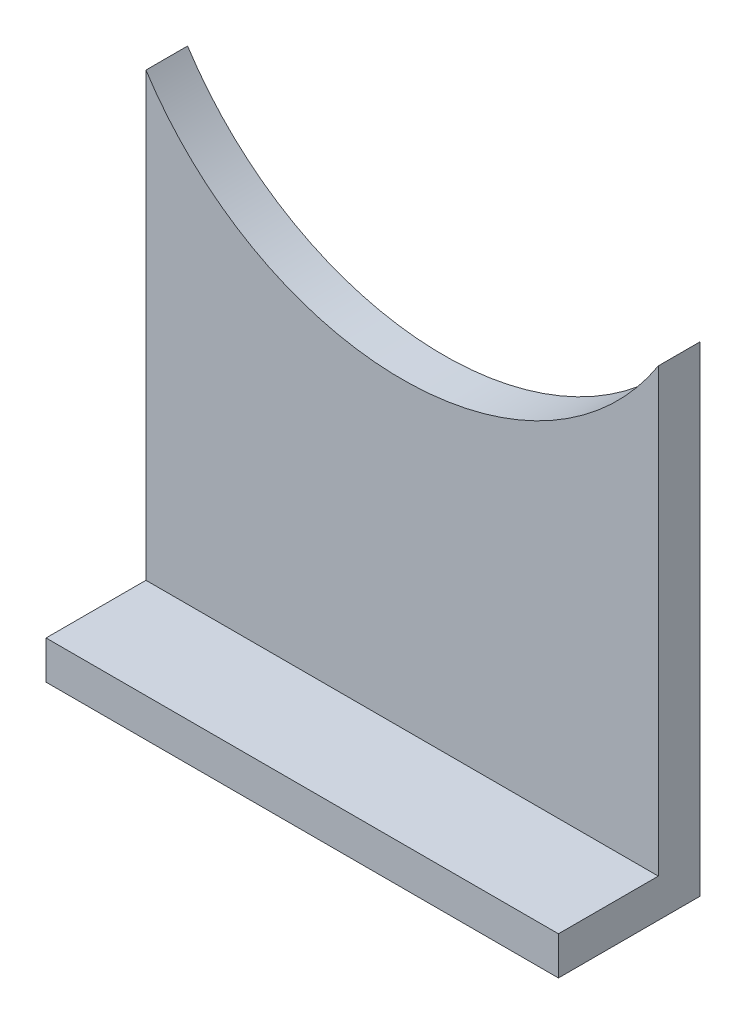
ISO-10303-21;
HEADER;
FILE_DESCRIPTION(('STEP AP214'),'2;1');
FILE_NAME('part.step','',(''),(''),'','','');
FILE_SCHEMA(('AUTOMOTIVE_DESIGN { 1 0 10303 214 1 1 1 1 }'));
ENDSEC;
DATA;
#1=APPLICATION_CONTEXT('core data for automotive mechanical design processes');
#2=APPLICATION_PROTOCOL_DEFINITION('international standard','automotive_design',2000,#1);
#3=PRODUCT_CONTEXT('',#1,'mechanical');
#4=PRODUCT('Part','Part','',(#3));
#5=PRODUCT_RELATED_PRODUCT_CATEGORY('part','',(#4));
#6=PRODUCT_DEFINITION_FORMATION('','',#4);
#7=PRODUCT_DEFINITION_CONTEXT('part definition',#1,'design');
#8=PRODUCT_DEFINITION('design','',#6,#7);
#9=PRODUCT_DEFINITION_SHAPE('','',#8);
#10=(LENGTH_UNIT() NAMED_UNIT(*) SI_UNIT(.MILLI.,.METRE.));
#11=(NAMED_UNIT(*) PLANE_ANGLE_UNIT() SI_UNIT($,.RADIAN.));
#12=(NAMED_UNIT(*) SI_UNIT($,.STERADIAN.) SOLID_ANGLE_UNIT());
#13=UNCERTAINTY_MEASURE_WITH_UNIT(LENGTH_MEASURE(1.E-05),#10,'distance_accuracy_value','');
#14=(GEOMETRIC_REPRESENTATION_CONTEXT(3) GLOBAL_UNCERTAINTY_ASSIGNED_CONTEXT((#13)) GLOBAL_UNIT_ASSIGNED_CONTEXT((#10,
#11,#12)) REPRESENTATION_CONTEXT('',''));
#15=CARTESIAN_POINT('',(0.,0.,0.));
#16=DIRECTION('',(0.,0.,1.));
#17=DIRECTION('',(1.,0.,0.));
#18=AXIS2_PLACEMENT_3D('',#15,#16,#17);
#19=CARTESIAN_POINT('',(0.,0.,63.5));
#20=DIRECTION('',(0.,0.,-1.));
#21=DIRECTION('',(-1.,0.,0.));
#22=AXIS2_PLACEMENT_3D('',#19,#20,#21);
#23=CYLINDRICAL_SURFACE('',#22,464.82);
#24=CARTESIAN_POINT('',(0.,0.,0.));
#25=DIRECTION('',(0.,0.,-1.));
#26=DIRECTION('',(1.,0.,0.));
#27=AXIS2_PLACEMENT_3D('',#24,#25,#26);
#28=CIRCLE('',#27,464.82);
#29=CARTESIAN_POINT('',(390.861421716454,-251.56506397708,0.));
#30=VERTEX_POINT('',#29);
#31=CARTESIAN_POINT('',(-390.861421716454,-251.56506397708,0.));
#32=VERTEX_POINT('',#31);
#33=EDGE_CURVE('E99',#30,#32,#28,.T.);
#34=ORIENTED_EDGE('',*,*,#33,.T.);
#35=DIRECTION('',(0.,0.,-1.));
#36=VECTOR('',#35,1.);
#37=CARTESIAN_POINT('',(-390.861421716454,-251.56506397708,63.5));
#38=LINE('',#37,#36);
#39=CARTESIAN_POINT('',(-390.861421716454,-251.56506397708,63.5));
#40=VERTEX_POINT('',#39);
#41=EDGE_CURVE('E11',#40,#32,#38,.T.);
#42=ORIENTED_EDGE('',*,*,#41,.F.);
#43=CARTESIAN_POINT('',(0.,0.,63.5));
#44=DIRECTION('',(0.,0.,-1.));
#45=DIRECTION('',(1.,0.,0.));
#46=AXIS2_PLACEMENT_3D('',#43,#44,#45);
#47=CIRCLE('',#46,464.82);
#48=CARTESIAN_POINT('',(390.861421716454,-251.56506397708,63.5));
#49=VERTEX_POINT('',#48);
#50=EDGE_CURVE('E93',#49,#40,#47,.T.);
#51=ORIENTED_EDGE('',*,*,#50,.F.);
#52=DIRECTION('',(0.,0.,-1.));
#53=VECTOR('',#52,1.);
#54=CARTESIAN_POINT('',(390.861421716454,-251.56506397708,63.5));
#55=LINE('',#54,#53);
#56=EDGE_CURVE('E85',#49,#30,#55,.T.);
#57=ORIENTED_EDGE('',*,*,#56,.T.);
#58=EDGE_LOOP('',(#34,#42,#51,#57));
#59=FACE_BOUND('',#58,.T.);
#60=ADVANCED_FACE('F43',(#59),#23,.F.);
#61=CARTESIAN_POINT('',(-390.861421716454,-984.152448318859,63.5));
#62=DIRECTION('',(1.,0.,0.));
#63=DIRECTION('',(0.,0.,-1.));
#64=AXIS2_PLACEMENT_3D('',#61,#62,#63);
#65=PLANE('',#64);
#66=DIRECTION('',(0.,-1.,0.));
#67=VECTOR('',#66,1.);
#68=CARTESIAN_POINT('',(-390.861421716454,-984.152448318859,0.));
#69=LINE('',#68,#67);
#70=CARTESIAN_POINT('',(-390.861421716454,-984.152448318859,0.));
#71=VERTEX_POINT('',#70);
#72=EDGE_CURVE('E102',#32,#71,#69,.T.);
#73=ORIENTED_EDGE('',*,*,#72,.T.);
#74=DIRECTION('',(0.,0.,-1.));
#75=VECTOR('',#74,1.);
#76=CARTESIAN_POINT('',(-390.861421716454,-984.152448318859,63.5));
#77=LINE('',#76,#75);
#78=CARTESIAN_POINT('',(-390.861421716454,-984.152448318859,215.9));
#79=VERTEX_POINT('',#78);
#80=EDGE_CURVE('E50',#79,#71,#77,.T.);
#81=ORIENTED_EDGE('',*,*,#80,.F.);
#82=DIRECTION('',(0.,-1.,0.));
#83=VECTOR('',#82,1.);
#84=CARTESIAN_POINT('',(-390.861421716454,-984.152448318859,215.9));
#85=LINE('',#84,#83);
#86=CARTESIAN_POINT('',(-390.861421716454,-925.732448318859,215.9));
#87=VERTEX_POINT('',#86);
#88=EDGE_CURVE('E126',#87,#79,#85,.T.);
#89=ORIENTED_EDGE('',*,*,#88,.F.);
#90=DIRECTION('',(0.,0.,-1.));
#91=VECTOR('',#90,1.);
#92=CARTESIAN_POINT('',(-390.861421716454,-925.732448318859,215.9));
#93=LINE('',#92,#91);
#94=CARTESIAN_POINT('',(-390.861421716454,-925.732448318859,63.5));
#95=VERTEX_POINT('',#94);
#96=EDGE_CURVE('E107',#87,#95,#93,.T.);
#97=ORIENTED_EDGE('',*,*,#96,.T.);
#98=DIRECTION('',(0.,-1.,0.));
#99=VECTOR('',#98,1.);
#100=CARTESIAN_POINT('',(-390.861421716454,-984.152448318859,63.5));
#101=LINE('',#100,#99);
#102=EDGE_CURVE('E149',#40,#95,#101,.T.);
#103=ORIENTED_EDGE('',*,*,#102,.F.);
#104=ORIENTED_EDGE('',*,*,#41,.T.);
#105=EDGE_LOOP('',(#73,#81,#89,#97,#103,#104));
#106=FACE_BOUND('',#105,.T.);
#107=ADVANCED_FACE('F124',(#106),#65,.F.);
#108=CARTESIAN_POINT('',(390.861421716454,-984.152448318859,63.5));
#109=DIRECTION('',(0.,1.,0.));
#110=DIRECTION('',(0.,0.,1.));
#111=AXIS2_PLACEMENT_3D('',#108,#109,#110);
#112=PLANE('',#111);
#113=DIRECTION('',(1.,0.,0.));
#114=VECTOR('',#113,1.);
#115=CARTESIAN_POINT('',(390.861421716454,-984.152448318859,0.));
#116=LINE('',#115,#114);
#117=CARTESIAN_POINT('',(390.861421716454,-984.152448318859,0.));
#118=VERTEX_POINT('',#117);
#119=EDGE_CURVE('E94',#71,#118,#116,.T.);
#120=ORIENTED_EDGE('',*,*,#119,.T.);
#121=DIRECTION('',(0.,0.,-1.));
#122=VECTOR('',#121,1.);
#123=CARTESIAN_POINT('',(390.861421716454,-984.152448318859,63.5));
#124=LINE('',#123,#122);
#125=CARTESIAN_POINT('',(390.861421716454,-984.152448318859,215.9));
#126=VERTEX_POINT('',#125);
#127=EDGE_CURVE('E89',#126,#118,#124,.T.);
#128=ORIENTED_EDGE('',*,*,#127,.F.);
#129=DIRECTION('',(1.,0.,0.));
#130=VECTOR('',#129,1.);
#131=CARTESIAN_POINT('',(-390.861421716454,-984.152448318859,215.9));
#132=LINE('',#131,#130);
#133=EDGE_CURVE('E120',#79,#126,#132,.T.);
#134=ORIENTED_EDGE('',*,*,#133,.F.);
#135=ORIENTED_EDGE('',*,*,#80,.T.);
#136=EDGE_LOOP('',(#120,#128,#134,#135));
#137=FACE_BOUND('',#136,.T.);
#138=ADVANCED_FACE('F117',(#137),#112,.F.);
#139=CARTESIAN_POINT('',(390.861421716454,-251.56506397708,63.5));
#140=DIRECTION('',(-1.,0.,0.));
#141=DIRECTION('',(0.,0.,1.));
#142=AXIS2_PLACEMENT_3D('',#139,#140,#141);
#143=PLANE('',#142);
#144=DIRECTION('',(0.,1.,0.));
#145=VECTOR('',#144,1.);
#146=CARTESIAN_POINT('',(390.861421716454,-251.56506397708,0.));
#147=LINE('',#146,#145);
#148=EDGE_CURVE('E82',#118,#30,#147,.T.);
#149=ORIENTED_EDGE('',*,*,#148,.T.);
#150=ORIENTED_EDGE('',*,*,#56,.F.);
#151=DIRECTION('',(0.,1.,0.));
#152=VECTOR('',#151,1.);
#153=CARTESIAN_POINT('',(390.861421716454,-251.56506397708,63.5));
#154=LINE('',#153,#152);
#155=CARTESIAN_POINT('',(390.861421716454,-925.732448318859,63.5));
#156=VERTEX_POINT('',#155);
#157=EDGE_CURVE('E62',#156,#49,#154,.T.);
#158=ORIENTED_EDGE('',*,*,#157,.F.);
#159=DIRECTION('',(0.,0.,-1.));
#160=VECTOR('',#159,1.);
#161=CARTESIAN_POINT('',(390.861421716454,-925.732448318859,215.9));
#162=LINE('',#161,#160);
#163=CARTESIAN_POINT('',(390.861421716454,-925.732448318859,215.9));
#164=VERTEX_POINT('',#163);
#165=EDGE_CURVE('E103',#164,#156,#162,.T.);
#166=ORIENTED_EDGE('',*,*,#165,.F.);
#167=DIRECTION('',(0.,1.,0.));
#168=VECTOR('',#167,1.);
#169=CARTESIAN_POINT('',(390.861421716454,-984.152448318859,215.9));
#170=LINE('',#169,#168);
#171=EDGE_CURVE('E141',#126,#164,#170,.T.);
#172=ORIENTED_EDGE('',*,*,#171,.F.);
#173=ORIENTED_EDGE('',*,*,#127,.T.);
#174=EDGE_LOOP('',(#149,#150,#158,#166,#172,#173));
#175=FACE_BOUND('',#174,.T.);
#176=ADVANCED_FACE('F84',(#175),#143,.F.);
#177=CARTESIAN_POINT('',(0.,0.,63.5));
#178=DIRECTION('',(0.,0.,1.));
#179=DIRECTION('',(1.,0.,0.));
#180=AXIS2_PLACEMENT_3D('',#177,#178,#179);
#181=PLANE('',#180);
#182=DIRECTION('',(-1.,0.,0.));
#183=VECTOR('',#182,1.);
#184=CARTESIAN_POINT('',(-390.861421716454,-925.732448318859,63.5));
#185=LINE('',#184,#183);
#186=EDGE_CURVE('E57',#156,#95,#185,.T.);
#187=ORIENTED_EDGE('',*,*,#186,.F.);
#188=ORIENTED_EDGE('',*,*,#157,.T.);
#189=ORIENTED_EDGE('',*,*,#50,.T.);
#190=ORIENTED_EDGE('',*,*,#102,.T.);
#191=EDGE_LOOP('',(#187,#188,#189,#190));
#192=FACE_BOUND('',#191,.T.);
#193=ADVANCED_FACE('F150',(#192),#181,.T.);
#194=CARTESIAN_POINT('',(0.,0.,0.));
#195=DIRECTION('',(0.,0.,1.));
#196=DIRECTION('',(1.,0.,0.));
#197=AXIS2_PLACEMENT_3D('',#194,#195,#196);
#198=PLANE('',#197);
#199=ORIENTED_EDGE('',*,*,#33,.F.);
#200=ORIENTED_EDGE('',*,*,#148,.F.);
#201=ORIENTED_EDGE('',*,*,#119,.F.);
#202=ORIENTED_EDGE('',*,*,#72,.F.);
#203=EDGE_LOOP('',(#199,#200,#201,#202));
#204=FACE_BOUND('',#203,.T.);
#205=ADVANCED_FACE('F101',(#204),#198,.F.);
#206=CARTESIAN_POINT('',(-390.861421716454,-925.732448318859,215.9));
#207=DIRECTION('',(0.,-1.,0.));
#208=DIRECTION('',(0.,0.,-1.));
#209=AXIS2_PLACEMENT_3D('',#206,#207,#208);
#210=PLANE('',#209);
#211=ORIENTED_EDGE('',*,*,#186,.T.);
#212=ORIENTED_EDGE('',*,*,#96,.F.);
#213=DIRECTION('',(-1.,0.,0.));
#214=VECTOR('',#213,1.);
#215=CARTESIAN_POINT('',(-390.861421716454,-925.732448318859,215.9));
#216=LINE('',#215,#214);
#217=EDGE_CURVE('E138',#164,#87,#216,.T.);
#218=ORIENTED_EDGE('',*,*,#217,.F.);
#219=ORIENTED_EDGE('',*,*,#165,.T.);
#220=EDGE_LOOP('',(#211,#212,#218,#219));
#221=FACE_BOUND('',#220,.T.);
#222=ADVANCED_FACE('F145',(#221),#210,.F.);
#223=CARTESIAN_POINT('',(0.,0.,215.9));
#224=DIRECTION('',(0.,0.,-1.));
#225=DIRECTION('',(-1.,0.,0.));
#226=AXIS2_PLACEMENT_3D('',#223,#224,#225);
#227=PLANE('',#226);
#228=ORIENTED_EDGE('',*,*,#88,.T.);
#229=ORIENTED_EDGE('',*,*,#133,.T.);
#230=ORIENTED_EDGE('',*,*,#171,.T.);
#231=ORIENTED_EDGE('',*,*,#217,.T.);
#232=EDGE_LOOP('',(#228,#229,#230,#231));
#233=FACE_BOUND('',#232,.T.);
#234=ADVANCED_FACE('F140',(#233),#227,.F.);
#235=CLOSED_SHELL('',(#60,#107,#138,#176,#193,#205,#222,#234));
#236=MANIFOLD_SOLID_BREP('B2',#235);
#237=ADVANCED_BREP_SHAPE_REPRESENTATION('',(#18,#236),#14);
#238=SHAPE_DEFINITION_REPRESENTATION(#9,#237);
ENDSEC;
END-ISO-10303-21;
